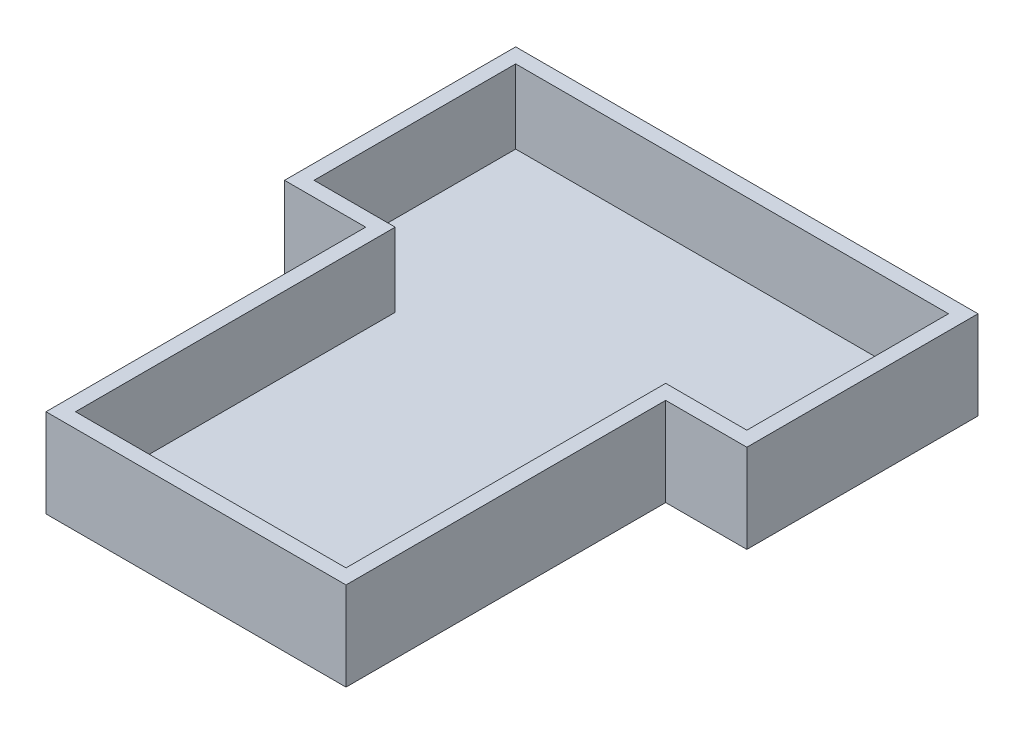
ISO-10303-21;
HEADER;
FILE_DESCRIPTION(('STEP AP214'),'2;1');
FILE_NAME('part.step','',(''),(''),'','','');
FILE_SCHEMA(('AUTOMOTIVE_DESIGN { 1 0 10303 214 1 1 1 1 }'));
ENDSEC;
DATA;
#1=APPLICATION_CONTEXT('core data for automotive mechanical design processes');
#2=APPLICATION_PROTOCOL_DEFINITION('international standard','automotive_design',2000,#1);
#3=PRODUCT_CONTEXT('',#1,'mechanical');
#4=PRODUCT('Part','Part','',(#3));
#5=PRODUCT_RELATED_PRODUCT_CATEGORY('part','',(#4));
#6=PRODUCT_DEFINITION_FORMATION('','',#4);
#7=PRODUCT_DEFINITION_CONTEXT('part definition',#1,'design');
#8=PRODUCT_DEFINITION('design','',#6,#7);
#9=PRODUCT_DEFINITION_SHAPE('','',#8);
#10=(LENGTH_UNIT() NAMED_UNIT(*) SI_UNIT(.MILLI.,.METRE.));
#11=(NAMED_UNIT(*) PLANE_ANGLE_UNIT() SI_UNIT($,.RADIAN.));
#12=(NAMED_UNIT(*) SI_UNIT($,.STERADIAN.) SOLID_ANGLE_UNIT());
#13=UNCERTAINTY_MEASURE_WITH_UNIT(LENGTH_MEASURE(1.E-05),#10,'distance_accuracy_value','');
#14=(GEOMETRIC_REPRESENTATION_CONTEXT(3) GLOBAL_UNCERTAINTY_ASSIGNED_CONTEXT((#13)) GLOBAL_UNIT_ASSIGNED_CONTEXT((#10,
#11,#12)) REPRESENTATION_CONTEXT('',''));
#15=CARTESIAN_POINT('',(0.,0.,0.));
#16=DIRECTION('',(0.,0.,1.));
#17=DIRECTION('',(1.,0.,0.));
#18=AXIS2_PLACEMENT_3D('',#15,#16,#17);
#19=CARTESIAN_POINT('',(0.,15.,0.));
#20=DIRECTION('',(0.,-1.,0.));
#21=DIRECTION('',(0.,0.,-1.));
#22=AXIS2_PLACEMENT_3D('',#19,#20,#21);
#23=PLANE('',#22);
#24=DIRECTION('',(0.,0.,1.));
#25=VECTOR('',#24,1.);
#26=CARTESIAN_POINT('',(-3.,15.,0.));
#27=LINE('',#26,#25);
#28=CARTESIAN_POINT('',(-3.,15.,-3.));
#29=VERTEX_POINT('',#28);
#30=CARTESIAN_POINT('',(-3.,15.,44.));
#31=VERTEX_POINT('',#30);
#32=EDGE_CURVE('E253',#29,#31,#27,.T.);
#33=ORIENTED_EDGE('',*,*,#32,.T.);
#34=DIRECTION('',(1.,0.,0.));
#35=VECTOR('',#34,1.);
#36=CARTESIAN_POINT('',(0.,15.,44.));
#37=LINE('',#36,#35);
#38=CARTESIAN_POINT('',(13.5,15.,44.));
#39=VERTEX_POINT('',#38);
#40=EDGE_CURVE('E255',#31,#39,#37,.T.);
#41=ORIENTED_EDGE('',*,*,#40,.T.);
#42=DIRECTION('',(0.,0.,1.));
#43=VECTOR('',#42,1.);
#44=CARTESIAN_POINT('',(13.5,15.,0.));
#45=LINE('',#44,#43);
#46=CARTESIAN_POINT('',(13.5,15.,109.));
#47=VERTEX_POINT('',#46);
#48=EDGE_CURVE('E257',#39,#47,#45,.T.);
#49=ORIENTED_EDGE('',*,*,#48,.T.);
#50=DIRECTION('',(1.,0.,0.));
#51=VECTOR('',#50,1.);
#52=CARTESIAN_POINT('',(0.,15.,109.));
#53=LINE('',#52,#51);
#54=CARTESIAN_POINT('',(74.5,15.,109.));
#55=VERTEX_POINT('',#54);
#56=EDGE_CURVE('E259',#47,#55,#53,.T.);
#57=ORIENTED_EDGE('',*,*,#56,.T.);
#58=DIRECTION('',(0.,0.,-1.));
#59=VECTOR('',#58,1.);
#60=CARTESIAN_POINT('',(74.5,15.,0.));
#61=LINE('',#60,#59);
#62=CARTESIAN_POINT('',(74.5,15.,44.));
#63=VERTEX_POINT('',#62);
#64=EDGE_CURVE('E261',#55,#63,#61,.T.);
#65=ORIENTED_EDGE('',*,*,#64,.T.);
#66=DIRECTION('',(1.,0.,0.));
#67=VECTOR('',#66,1.);
#68=CARTESIAN_POINT('',(0.,15.,44.));
#69=LINE('',#68,#67);
#70=CARTESIAN_POINT('',(91.,15.,44.));
#71=VERTEX_POINT('',#70);
#72=EDGE_CURVE('E263',#63,#71,#69,.T.);
#73=ORIENTED_EDGE('',*,*,#72,.T.);
#74=DIRECTION('',(0.,0.,-1.));
#75=VECTOR('',#74,1.);
#76=CARTESIAN_POINT('',(91.,15.,0.));
#77=LINE('',#76,#75);
#78=CARTESIAN_POINT('',(91.,15.,-3.));
#79=VERTEX_POINT('',#78);
#80=EDGE_CURVE('E264',#71,#79,#77,.T.);
#81=ORIENTED_EDGE('',*,*,#80,.T.);
#82=DIRECTION('',(-1.,0.,0.));
#83=VECTOR('',#82,1.);
#84=CARTESIAN_POINT('',(0.,15.,-3.));
#85=LINE('',#84,#83);
#86=EDGE_CURVE('E37',#79,#29,#85,.T.);
#87=ORIENTED_EDGE('',*,*,#86,.T.);
#88=EDGE_LOOP('',(#33,#41,#49,#57,#65,#73,#81,#87));
#89=FACE_BOUND('',#88,.T.);
#90=DIRECTION('',(0.,0.,1.));
#91=VECTOR('',#90,1.);
#92=CARTESIAN_POINT('',(0.,15.,41.));
#93=LINE('',#92,#91);
#94=CARTESIAN_POINT('',(0.,15.,0.));
#95=VERTEX_POINT('',#94);
#96=CARTESIAN_POINT('',(0.,15.,41.));
#97=VERTEX_POINT('',#96);
#98=EDGE_CURVE('E150',#95,#97,#93,.T.);
#99=ORIENTED_EDGE('',*,*,#98,.F.);
#100=DIRECTION('',(-1.,0.,0.));
#101=VECTOR('',#100,1.);
#102=CARTESIAN_POINT('',(0.,15.,0.));
#103=LINE('',#102,#101);
#104=CARTESIAN_POINT('',(88.,15.,0.));
#105=VERTEX_POINT('',#104);
#106=EDGE_CURVE('E186',#105,#95,#103,.T.);
#107=ORIENTED_EDGE('',*,*,#106,.F.);
#108=DIRECTION('',(0.,0.,-1.));
#109=VECTOR('',#108,1.);
#110=CARTESIAN_POINT('',(88.,15.,0.));
#111=LINE('',#110,#109);
#112=CARTESIAN_POINT('',(88.,15.,41.));
#113=VERTEX_POINT('',#112);
#114=EDGE_CURVE('E184',#113,#105,#111,.T.);
#115=ORIENTED_EDGE('',*,*,#114,.F.);
#116=DIRECTION('',(1.,0.,0.));
#117=VECTOR('',#116,1.);
#118=CARTESIAN_POINT('',(88.,15.,41.));
#119=LINE('',#118,#117);
#120=CARTESIAN_POINT('',(71.5,15.,41.));
#121=VERTEX_POINT('',#120);
#122=EDGE_CURVE('E182',#121,#113,#119,.T.);
#123=ORIENTED_EDGE('',*,*,#122,.F.);
#124=DIRECTION('',(0.,0.,-1.));
#125=VECTOR('',#124,1.);
#126=CARTESIAN_POINT('',(71.5,15.,41.));
#127=LINE('',#126,#125);
#128=CARTESIAN_POINT('',(71.5,15.,106.));
#129=VERTEX_POINT('',#128);
#130=EDGE_CURVE('E180',#129,#121,#127,.T.);
#131=ORIENTED_EDGE('',*,*,#130,.F.);
#132=DIRECTION('',(1.,0.,0.));
#133=VECTOR('',#132,1.);
#134=CARTESIAN_POINT('',(71.5,15.,106.));
#135=LINE('',#134,#133);
#136=CARTESIAN_POINT('',(16.5,15.,106.));
#137=VERTEX_POINT('',#136);
#138=EDGE_CURVE('E176',#137,#129,#135,.T.);
#139=ORIENTED_EDGE('',*,*,#138,.F.);
#140=DIRECTION('',(0.,0.,1.));
#141=VECTOR('',#140,1.);
#142=CARTESIAN_POINT('',(16.5,15.,106.));
#143=LINE('',#142,#141);
#144=CARTESIAN_POINT('',(16.5,15.,41.));
#145=VERTEX_POINT('',#144);
#146=EDGE_CURVE('E174',#145,#137,#143,.T.);
#147=ORIENTED_EDGE('',*,*,#146,.F.);
#148=DIRECTION('',(1.,0.,0.));
#149=VECTOR('',#148,1.);
#150=CARTESIAN_POINT('',(16.5,15.,41.));
#151=LINE('',#150,#149);
#152=EDGE_CURVE('E161',#97,#145,#151,.T.);
#153=ORIENTED_EDGE('',*,*,#152,.F.);
#154=EDGE_LOOP('',(#99,#107,#115,#123,#131,#139,#147,#153));
#155=FACE_BOUND('',#154,.T.);
#156=ADVANCED_FACE('F33',(#89,#155),#23,.F.);
#157=CARTESIAN_POINT('',(-3.,15.,41.));
#158=DIRECTION('',(1.,0.,0.));
#159=DIRECTION('',(0.,0.,-1.));
#160=AXIS2_PLACEMENT_3D('',#157,#158,#159);
#161=PLANE('',#160);
#162=DIRECTION('',(0.,0.,1.));
#163=VECTOR('',#162,1.);
#164=CARTESIAN_POINT('',(-3.,-3.,0.));
#165=LINE('',#164,#163);
#166=CARTESIAN_POINT('',(-3.,-3.,-3.));
#167=VERTEX_POINT('',#166);
#168=CARTESIAN_POINT('',(-3.,-3.,44.));
#169=VERTEX_POINT('',#168);
#170=EDGE_CURVE('E169',#167,#169,#165,.T.);
#171=ORIENTED_EDGE('',*,*,#170,.T.);
#172=DIRECTION('',(0.,-1.,0.));
#173=VECTOR('',#172,1.);
#174=CARTESIAN_POINT('',(-3.,15.,44.));
#175=LINE('',#174,#173);
#176=EDGE_CURVE('E11',#31,#169,#175,.T.);
#177=ORIENTED_EDGE('',*,*,#176,.F.);
#178=ORIENTED_EDGE('',*,*,#32,.F.);
#179=DIRECTION('',(0.,-1.,0.));
#180=VECTOR('',#179,1.);
#181=CARTESIAN_POINT('',(-3.,15.,-3.));
#182=LINE('',#181,#180);
#183=EDGE_CURVE('E220',#29,#167,#182,.T.);
#184=ORIENTED_EDGE('',*,*,#183,.T.);
#185=EDGE_LOOP('',(#171,#177,#178,#184));
#186=FACE_BOUND('',#185,.T.);
#187=ADVANCED_FACE('F279',(#186),#161,.F.);
#188=CARTESIAN_POINT('',(16.5,15.,44.));
#189=DIRECTION('',(0.,0.,-1.));
#190=DIRECTION('',(-1.,0.,0.));
#191=AXIS2_PLACEMENT_3D('',#188,#189,#190);
#192=PLANE('',#191);
#193=DIRECTION('',(1.,0.,0.));
#194=VECTOR('',#193,1.);
#195=CARTESIAN_POINT('',(0.,-3.,44.));
#196=LINE('',#195,#194);
#197=CARTESIAN_POINT('',(13.5,-3.,44.));
#198=VERTEX_POINT('',#197);
#199=EDGE_CURVE('E218',#169,#198,#196,.T.);
#200=ORIENTED_EDGE('',*,*,#199,.T.);
#201=DIRECTION('',(0.,-1.,0.));
#202=VECTOR('',#201,1.);
#203=CARTESIAN_POINT('',(13.5,15.,44.));
#204=LINE('',#203,#202);
#205=EDGE_CURVE('E42',#39,#198,#204,.T.);
#206=ORIENTED_EDGE('',*,*,#205,.F.);
#207=ORIENTED_EDGE('',*,*,#40,.F.);
#208=ORIENTED_EDGE('',*,*,#176,.T.);
#209=EDGE_LOOP('',(#200,#206,#207,#208));
#210=FACE_BOUND('',#209,.T.);
#211=ADVANCED_FACE('F284',(#210),#192,.F.);
#212=CARTESIAN_POINT('',(13.5,15.,106.));
#213=DIRECTION('',(1.,0.,0.));
#214=DIRECTION('',(0.,0.,-1.));
#215=AXIS2_PLACEMENT_3D('',#212,#213,#214);
#216=PLANE('',#215);
#217=DIRECTION('',(0.,0.,1.));
#218=VECTOR('',#217,1.);
#219=CARTESIAN_POINT('',(13.5,-3.,0.));
#220=LINE('',#219,#218);
#221=CARTESIAN_POINT('',(13.5,-3.,109.));
#222=VERTEX_POINT('',#221);
#223=EDGE_CURVE('E225',#198,#222,#220,.T.);
#224=ORIENTED_EDGE('',*,*,#223,.T.);
#225=DIRECTION('',(0.,-1.,0.));
#226=VECTOR('',#225,1.);
#227=CARTESIAN_POINT('',(13.5,15.,109.));
#228=LINE('',#227,#226);
#229=EDGE_CURVE('E228',#47,#222,#228,.T.);
#230=ORIENTED_EDGE('',*,*,#229,.F.);
#231=ORIENTED_EDGE('',*,*,#48,.F.);
#232=ORIENTED_EDGE('',*,*,#205,.T.);
#233=EDGE_LOOP('',(#224,#230,#231,#232));
#234=FACE_BOUND('',#233,.T.);
#235=ADVANCED_FACE('F287',(#234),#216,.F.);
#236=CARTESIAN_POINT('',(71.5,15.,109.));
#237=DIRECTION('',(0.,0.,-1.));
#238=DIRECTION('',(-1.,0.,0.));
#239=AXIS2_PLACEMENT_3D('',#236,#237,#238);
#240=PLANE('',#239);
#241=DIRECTION('',(1.,0.,0.));
#242=VECTOR('',#241,1.);
#243=CARTESIAN_POINT('',(0.,-3.,109.));
#244=LINE('',#243,#242);
#245=CARTESIAN_POINT('',(74.5,-3.,109.));
#246=VERTEX_POINT('',#245);
#247=EDGE_CURVE('E230',#222,#246,#244,.T.);
#248=ORIENTED_EDGE('',*,*,#247,.T.);
#249=DIRECTION('',(0.,-1.,0.));
#250=VECTOR('',#249,1.);
#251=CARTESIAN_POINT('',(74.5,15.,109.));
#252=LINE('',#251,#250);
#253=EDGE_CURVE('E233',#55,#246,#252,.T.);
#254=ORIENTED_EDGE('',*,*,#253,.F.);
#255=ORIENTED_EDGE('',*,*,#56,.F.);
#256=ORIENTED_EDGE('',*,*,#229,.T.);
#257=EDGE_LOOP('',(#248,#254,#255,#256));
#258=FACE_BOUND('',#257,.T.);
#259=ADVANCED_FACE('F292',(#258),#240,.F.);
#260=CARTESIAN_POINT('',(74.5,15.,41.));
#261=DIRECTION('',(-1.,0.,0.));
#262=DIRECTION('',(0.,0.,1.));
#263=AXIS2_PLACEMENT_3D('',#260,#261,#262);
#264=PLANE('',#263);
#265=DIRECTION('',(0.,0.,-1.));
#266=VECTOR('',#265,1.);
#267=CARTESIAN_POINT('',(74.5,-3.,0.));
#268=LINE('',#267,#266);
#269=CARTESIAN_POINT('',(74.5,-3.,44.));
#270=VERTEX_POINT('',#269);
#271=EDGE_CURVE('E235',#246,#270,#268,.T.);
#272=ORIENTED_EDGE('',*,*,#271,.T.);
#273=DIRECTION('',(0.,-1.,0.));
#274=VECTOR('',#273,1.);
#275=CARTESIAN_POINT('',(74.5,15.,44.));
#276=LINE('',#275,#274);
#277=EDGE_CURVE('E238',#63,#270,#276,.T.);
#278=ORIENTED_EDGE('',*,*,#277,.F.);
#279=ORIENTED_EDGE('',*,*,#64,.F.);
#280=ORIENTED_EDGE('',*,*,#253,.T.);
#281=EDGE_LOOP('',(#272,#278,#279,#280));
#282=FACE_BOUND('',#281,.T.);
#283=ADVANCED_FACE('F296',(#282),#264,.F.);
#284=CARTESIAN_POINT('',(88.,15.,44.));
#285=DIRECTION('',(0.,0.,-1.));
#286=DIRECTION('',(-1.,0.,0.));
#287=AXIS2_PLACEMENT_3D('',#284,#285,#286);
#288=PLANE('',#287);
#289=DIRECTION('',(1.,0.,0.));
#290=VECTOR('',#289,1.);
#291=CARTESIAN_POINT('',(0.,-3.,44.));
#292=LINE('',#291,#290);
#293=CARTESIAN_POINT('',(91.,-3.,44.));
#294=VERTEX_POINT('',#293);
#295=EDGE_CURVE('E240',#270,#294,#292,.T.);
#296=ORIENTED_EDGE('',*,*,#295,.T.);
#297=DIRECTION('',(0.,-1.,0.));
#298=VECTOR('',#297,1.);
#299=CARTESIAN_POINT('',(91.,15.,44.));
#300=LINE('',#299,#298);
#301=EDGE_CURVE('E243',#71,#294,#300,.T.);
#302=ORIENTED_EDGE('',*,*,#301,.F.);
#303=ORIENTED_EDGE('',*,*,#72,.F.);
#304=ORIENTED_EDGE('',*,*,#277,.T.);
#305=EDGE_LOOP('',(#296,#302,#303,#304));
#306=FACE_BOUND('',#305,.T.);
#307=ADVANCED_FACE('F300',(#306),#288,.F.);
#308=CARTESIAN_POINT('',(91.,15.,0.));
#309=DIRECTION('',(-1.,0.,0.));
#310=DIRECTION('',(0.,0.,1.));
#311=AXIS2_PLACEMENT_3D('',#308,#309,#310);
#312=PLANE('',#311);
#313=DIRECTION('',(0.,0.,-1.));
#314=VECTOR('',#313,1.);
#315=CARTESIAN_POINT('',(91.,-3.,0.));
#316=LINE('',#315,#314);
#317=CARTESIAN_POINT('',(91.,-3.,-3.));
#318=VERTEX_POINT('',#317);
#319=EDGE_CURVE('E245',#294,#318,#316,.T.);
#320=ORIENTED_EDGE('',*,*,#319,.T.);
#321=DIRECTION('',(0.,-1.,0.));
#322=VECTOR('',#321,1.);
#323=CARTESIAN_POINT('',(91.,15.,-3.));
#324=LINE('',#323,#322);
#325=EDGE_CURVE('E223',#79,#318,#324,.T.);
#326=ORIENTED_EDGE('',*,*,#325,.F.);
#327=ORIENTED_EDGE('',*,*,#80,.F.);
#328=ORIENTED_EDGE('',*,*,#301,.T.);
#329=EDGE_LOOP('',(#320,#326,#327,#328));
#330=FACE_BOUND('',#329,.T.);
#331=ADVANCED_FACE('F270',(#330),#312,.F.);
#332=CARTESIAN_POINT('',(0.,15.,-3.));
#333=DIRECTION('',(0.,0.,1.));
#334=DIRECTION('',(1.,0.,0.));
#335=AXIS2_PLACEMENT_3D('',#332,#333,#334);
#336=PLANE('',#335);
#337=DIRECTION('',(-1.,0.,0.));
#338=VECTOR('',#337,1.);
#339=CARTESIAN_POINT('',(0.,-3.,-3.));
#340=LINE('',#339,#338);
#341=EDGE_CURVE('E249',#318,#167,#340,.T.);
#342=ORIENTED_EDGE('',*,*,#341,.T.);
#343=ORIENTED_EDGE('',*,*,#183,.F.);
#344=ORIENTED_EDGE('',*,*,#86,.F.);
#345=ORIENTED_EDGE('',*,*,#325,.T.);
#346=EDGE_LOOP('',(#342,#343,#344,#345));
#347=FACE_BOUND('',#346,.T.);
#348=ADVANCED_FACE('F274',(#347),#336,.F.);
#349=CARTESIAN_POINT('',(0.,-3.,0.));
#350=DIRECTION('',(0.,-1.,0.));
#351=DIRECTION('',(0.,0.,-1.));
#352=AXIS2_PLACEMENT_3D('',#349,#350,#351);
#353=PLANE('',#352);
#354=ORIENTED_EDGE('',*,*,#170,.F.);
#355=ORIENTED_EDGE('',*,*,#341,.F.);
#356=ORIENTED_EDGE('',*,*,#319,.F.);
#357=ORIENTED_EDGE('',*,*,#295,.F.);
#358=ORIENTED_EDGE('',*,*,#271,.F.);
#359=ORIENTED_EDGE('',*,*,#247,.F.);
#360=ORIENTED_EDGE('',*,*,#223,.F.);
#361=ORIENTED_EDGE('',*,*,#199,.F.);
#362=EDGE_LOOP('',(#354,#355,#356,#357,#358,#359,#360,#361));
#363=FACE_BOUND('',#362,.T.);
#364=ADVANCED_FACE('F35',(#363),#353,.T.);
#365=CARTESIAN_POINT('',(0.,15.,41.));
#366=DIRECTION('',(1.,0.,0.));
#367=DIRECTION('',(0.,0.,-1.));
#368=AXIS2_PLACEMENT_3D('',#365,#366,#367);
#369=PLANE('',#368);
#370=DIRECTION('',(0.,0.,1.));
#371=VECTOR('',#370,1.);
#372=CARTESIAN_POINT('',(0.,0.,41.));
#373=LINE('',#372,#371);
#374=CARTESIAN_POINT('',(0.,0.,0.));
#375=VERTEX_POINT('',#374);
#376=CARTESIAN_POINT('',(0.,0.,41.));
#377=VERTEX_POINT('',#376);
#378=EDGE_CURVE('E188',#375,#377,#373,.T.);
#379=ORIENTED_EDGE('',*,*,#378,.F.);
#380=DIRECTION('',(0.,-1.,0.));
#381=VECTOR('',#380,1.);
#382=CARTESIAN_POINT('',(0.,15.,0.));
#383=LINE('',#382,#381);
#384=EDGE_CURVE('E157',#95,#375,#383,.T.);
#385=ORIENTED_EDGE('',*,*,#384,.F.);
#386=ORIENTED_EDGE('',*,*,#98,.T.);
#387=DIRECTION('',(0.,-1.,0.));
#388=VECTOR('',#387,1.);
#389=CARTESIAN_POINT('',(0.,15.,41.));
#390=LINE('',#389,#388);
#391=EDGE_CURVE('E154',#97,#377,#390,.T.);
#392=ORIENTED_EDGE('',*,*,#391,.T.);
#393=EDGE_LOOP('',(#379,#385,#386,#392));
#394=FACE_BOUND('',#393,.T.);
#395=ADVANCED_FACE('F153',(#394),#369,.T.);
#396=CARTESIAN_POINT('',(16.5,15.,41.));
#397=DIRECTION('',(0.,0.,-1.));
#398=DIRECTION('',(-1.,0.,0.));
#399=AXIS2_PLACEMENT_3D('',#396,#397,#398);
#400=PLANE('',#399);
#401=DIRECTION('',(1.,0.,0.));
#402=VECTOR('',#401,1.);
#403=CARTESIAN_POINT('',(16.5,0.,41.));
#404=LINE('',#403,#402);
#405=CARTESIAN_POINT('',(16.5,0.,41.));
#406=VERTEX_POINT('',#405);
#407=EDGE_CURVE('E168',#377,#406,#404,.T.);
#408=ORIENTED_EDGE('',*,*,#407,.F.);
#409=ORIENTED_EDGE('',*,*,#391,.F.);
#410=ORIENTED_EDGE('',*,*,#152,.T.);
#411=DIRECTION('',(0.,-1.,0.));
#412=VECTOR('',#411,1.);
#413=CARTESIAN_POINT('',(16.5,15.,41.));
#414=LINE('',#413,#412);
#415=EDGE_CURVE('E170',#145,#406,#414,.T.);
#416=ORIENTED_EDGE('',*,*,#415,.T.);
#417=EDGE_LOOP('',(#408,#409,#410,#416));
#418=FACE_BOUND('',#417,.T.);
#419=ADVANCED_FACE('F165',(#418),#400,.T.);
#420=CARTESIAN_POINT('',(16.5,15.,106.));
#421=DIRECTION('',(1.,0.,0.));
#422=DIRECTION('',(0.,0.,-1.));
#423=AXIS2_PLACEMENT_3D('',#420,#421,#422);
#424=PLANE('',#423);
#425=DIRECTION('',(0.,0.,1.));
#426=VECTOR('',#425,1.);
#427=CARTESIAN_POINT('',(16.5,0.,106.));
#428=LINE('',#427,#426);
#429=CARTESIAN_POINT('',(16.5,0.,106.));
#430=VERTEX_POINT('',#429);
#431=EDGE_CURVE('E191',#406,#430,#428,.T.);
#432=ORIENTED_EDGE('',*,*,#431,.F.);
#433=ORIENTED_EDGE('',*,*,#415,.F.);
#434=ORIENTED_EDGE('',*,*,#146,.T.);
#435=DIRECTION('',(0.,-1.,0.));
#436=VECTOR('',#435,1.);
#437=CARTESIAN_POINT('',(16.5,15.,106.));
#438=LINE('',#437,#436);
#439=EDGE_CURVE('E213',#137,#430,#438,.T.);
#440=ORIENTED_EDGE('',*,*,#439,.T.);
#441=EDGE_LOOP('',(#432,#433,#434,#440));
#442=FACE_BOUND('',#441,.T.);
#443=ADVANCED_FACE('F355',(#442),#424,.T.);
#444=CARTESIAN_POINT('',(71.5,15.,106.));
#445=DIRECTION('',(0.,0.,-1.));
#446=DIRECTION('',(-1.,0.,0.));
#447=AXIS2_PLACEMENT_3D('',#444,#445,#446);
#448=PLANE('',#447);
#449=DIRECTION('',(1.,0.,0.));
#450=VECTOR('',#449,1.);
#451=CARTESIAN_POINT('',(71.5,0.,106.));
#452=LINE('',#451,#450);
#453=CARTESIAN_POINT('',(71.5,0.,106.));
#454=VERTEX_POINT('',#453);
#455=EDGE_CURVE('E193',#430,#454,#452,.T.);
#456=ORIENTED_EDGE('',*,*,#455,.F.);
#457=ORIENTED_EDGE('',*,*,#439,.F.);
#458=ORIENTED_EDGE('',*,*,#138,.T.);
#459=DIRECTION('',(0.,-1.,0.));
#460=VECTOR('',#459,1.);
#461=CARTESIAN_POINT('',(71.5,15.,106.));
#462=LINE('',#461,#460);
#463=EDGE_CURVE('E210',#129,#454,#462,.T.);
#464=ORIENTED_EDGE('',*,*,#463,.T.);
#465=EDGE_LOOP('',(#456,#457,#458,#464));
#466=FACE_BOUND('',#465,.T.);
#467=ADVANCED_FACE('F363',(#466),#448,.T.);
#468=CARTESIAN_POINT('',(71.5,15.,41.));
#469=DIRECTION('',(-1.,0.,0.));
#470=DIRECTION('',(0.,0.,1.));
#471=AXIS2_PLACEMENT_3D('',#468,#469,#470);
#472=PLANE('',#471);
#473=DIRECTION('',(0.,0.,-1.));
#474=VECTOR('',#473,1.);
#475=CARTESIAN_POINT('',(71.5,0.,41.));
#476=LINE('',#475,#474);
#477=CARTESIAN_POINT('',(71.5,0.,41.));
#478=VERTEX_POINT('',#477);
#479=EDGE_CURVE('E195',#454,#478,#476,.T.);
#480=ORIENTED_EDGE('',*,*,#479,.F.);
#481=ORIENTED_EDGE('',*,*,#463,.F.);
#482=ORIENTED_EDGE('',*,*,#130,.T.);
#483=DIRECTION('',(0.,-1.,0.));
#484=VECTOR('',#483,1.);
#485=CARTESIAN_POINT('',(71.5,15.,41.));
#486=LINE('',#485,#484);
#487=EDGE_CURVE('E207',#121,#478,#486,.T.);
#488=ORIENTED_EDGE('',*,*,#487,.T.);
#489=EDGE_LOOP('',(#480,#481,#482,#488));
#490=FACE_BOUND('',#489,.T.);
#491=ADVANCED_FACE('F373',(#490),#472,.T.);
#492=CARTESIAN_POINT('',(88.,15.,41.));
#493=DIRECTION('',(0.,0.,-1.));
#494=DIRECTION('',(-1.,0.,0.));
#495=AXIS2_PLACEMENT_3D('',#492,#493,#494);
#496=PLANE('',#495);
#497=DIRECTION('',(1.,0.,0.));
#498=VECTOR('',#497,1.);
#499=CARTESIAN_POINT('',(88.,0.,41.));
#500=LINE('',#499,#498);
#501=CARTESIAN_POINT('',(88.,0.,41.));
#502=VERTEX_POINT('',#501);
#503=EDGE_CURVE('E197',#478,#502,#500,.T.);
#504=ORIENTED_EDGE('',*,*,#503,.F.);
#505=ORIENTED_EDGE('',*,*,#487,.F.);
#506=ORIENTED_EDGE('',*,*,#122,.T.);
#507=DIRECTION('',(0.,-1.,0.));
#508=VECTOR('',#507,1.);
#509=CARTESIAN_POINT('',(88.,15.,41.));
#510=LINE('',#509,#508);
#511=EDGE_CURVE('E204',#113,#502,#510,.T.);
#512=ORIENTED_EDGE('',*,*,#511,.T.);
#513=EDGE_LOOP('',(#504,#505,#506,#512));
#514=FACE_BOUND('',#513,.T.);
#515=ADVANCED_FACE('F383',(#514),#496,.T.);
#516=CARTESIAN_POINT('',(88.,15.,0.));
#517=DIRECTION('',(-1.,0.,0.));
#518=DIRECTION('',(0.,0.,1.));
#519=AXIS2_PLACEMENT_3D('',#516,#517,#518);
#520=PLANE('',#519);
#521=DIRECTION('',(0.,0.,-1.));
#522=VECTOR('',#521,1.);
#523=CARTESIAN_POINT('',(88.,0.,0.));
#524=LINE('',#523,#522);
#525=CARTESIAN_POINT('',(88.,0.,0.));
#526=VERTEX_POINT('',#525);
#527=EDGE_CURVE('E199',#502,#526,#524,.T.);
#528=ORIENTED_EDGE('',*,*,#527,.F.);
#529=ORIENTED_EDGE('',*,*,#511,.F.);
#530=ORIENTED_EDGE('',*,*,#114,.T.);
#531=DIRECTION('',(0.,-1.,0.));
#532=VECTOR('',#531,1.);
#533=CARTESIAN_POINT('',(88.,15.,0.));
#534=LINE('',#533,#532);
#535=EDGE_CURVE('E50',#105,#526,#534,.T.);
#536=ORIENTED_EDGE('',*,*,#535,.T.);
#537=EDGE_LOOP('',(#528,#529,#530,#536));
#538=FACE_BOUND('',#537,.T.);
#539=ADVANCED_FACE('F393',(#538),#520,.T.);
#540=CARTESIAN_POINT('',(0.,15.,0.));
#541=DIRECTION('',(0.,0.,1.));
#542=DIRECTION('',(1.,0.,0.));
#543=AXIS2_PLACEMENT_3D('',#540,#541,#542);
#544=PLANE('',#543);
#545=DIRECTION('',(-1.,0.,0.));
#546=VECTOR('',#545,1.);
#547=CARTESIAN_POINT('',(0.,0.,0.));
#548=LINE('',#547,#546);
#549=EDGE_CURVE('E162',#526,#375,#548,.T.);
#550=ORIENTED_EDGE('',*,*,#549,.F.);
#551=ORIENTED_EDGE('',*,*,#535,.F.);
#552=ORIENTED_EDGE('',*,*,#106,.T.);
#553=ORIENTED_EDGE('',*,*,#384,.T.);
#554=EDGE_LOOP('',(#550,#551,#552,#553));
#555=FACE_BOUND('',#554,.T.);
#556=ADVANCED_FACE('F403',(#555),#544,.T.);
#557=CARTESIAN_POINT('',(0.,0.,0.));
#558=DIRECTION('',(0.,-1.,0.));
#559=DIRECTION('',(0.,0.,-1.));
#560=AXIS2_PLACEMENT_3D('',#557,#558,#559);
#561=PLANE('',#560);
#562=ORIENTED_EDGE('',*,*,#378,.T.);
#563=ORIENTED_EDGE('',*,*,#407,.T.);
#564=ORIENTED_EDGE('',*,*,#431,.T.);
#565=ORIENTED_EDGE('',*,*,#455,.T.);
#566=ORIENTED_EDGE('',*,*,#479,.T.);
#567=ORIENTED_EDGE('',*,*,#503,.T.);
#568=ORIENTED_EDGE('',*,*,#527,.T.);
#569=ORIENTED_EDGE('',*,*,#549,.T.);
#570=EDGE_LOOP('',(#562,#563,#564,#565,#566,#567,#568,#569));
#571=FACE_BOUND('',#570,.T.);
#572=ADVANCED_FACE('F413',(#571),#561,.F.);
#573=CLOSED_SHELL('',(#156,#187,#211,#235,#259,#283,#307,#331,#348,#364,#395,#419,#443,#467,
#491,#515,#539,#556,#572));
#574=MANIFOLD_SOLID_BREP('B2',#573);
#575=ADVANCED_BREP_SHAPE_REPRESENTATION('',(#18,#574),#14);
#576=SHAPE_DEFINITION_REPRESENTATION(#9,#575);
ENDSEC;
END-ISO-10303-21;
